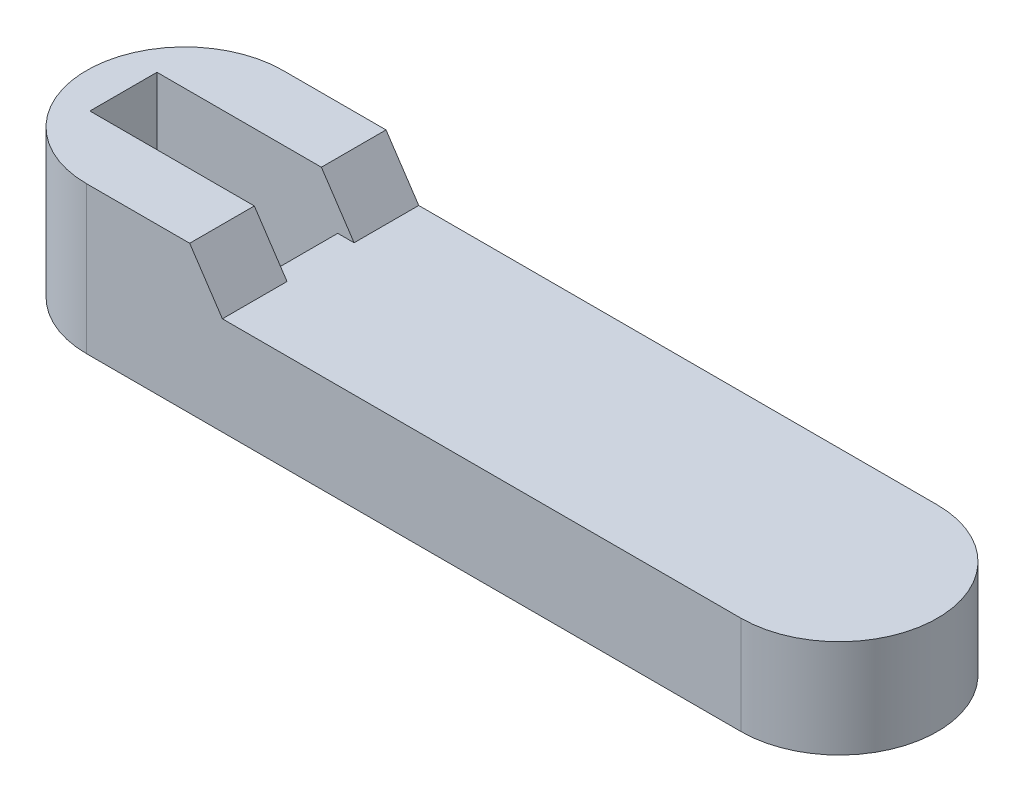
ISO-10303-21;
HEADER;
FILE_DESCRIPTION(('STEP AP214'),'2;1');
FILE_NAME('part.step','',(''),(''),'','','');
FILE_SCHEMA(('AUTOMOTIVE_DESIGN { 1 0 10303 214 1 1 1 1 }'));
ENDSEC;
DATA;
#1=APPLICATION_CONTEXT('core data for automotive mechanical design processes');
#2=APPLICATION_PROTOCOL_DEFINITION('international standard','automotive_design',2000,#1);
#3=PRODUCT_CONTEXT('',#1,'mechanical');
#4=PRODUCT('Part','Part','',(#3));
#5=PRODUCT_RELATED_PRODUCT_CATEGORY('part','',(#4));
#6=PRODUCT_DEFINITION_FORMATION('','',#4);
#7=PRODUCT_DEFINITION_CONTEXT('part definition',#1,'design');
#8=PRODUCT_DEFINITION('design','',#6,#7);
#9=PRODUCT_DEFINITION_SHAPE('','',#8);
#10=(LENGTH_UNIT() NAMED_UNIT(*) SI_UNIT(.MILLI.,.METRE.));
#11=(NAMED_UNIT(*) PLANE_ANGLE_UNIT() SI_UNIT($,.RADIAN.));
#12=(NAMED_UNIT(*) SI_UNIT($,.STERADIAN.) SOLID_ANGLE_UNIT());
#13=UNCERTAINTY_MEASURE_WITH_UNIT(LENGTH_MEASURE(1.E-05),#10,'distance_accuracy_value','');
#14=(GEOMETRIC_REPRESENTATION_CONTEXT(3) GLOBAL_UNCERTAINTY_ASSIGNED_CONTEXT((#13)) GLOBAL_UNIT_ASSIGNED_CONTEXT((#10,
#11,#12)) REPRESENTATION_CONTEXT('',''));
#15=CARTESIAN_POINT('',(0.,0.,0.));
#16=DIRECTION('',(0.,0.,1.));
#17=DIRECTION('',(1.,0.,0.));
#18=AXIS2_PLACEMENT_3D('',#15,#16,#17);
#19=CARTESIAN_POINT('',(0.,0.,-30.));
#20=DIRECTION('',(0.,-1.,0.));
#21=DIRECTION('',(0.,0.,-1.));
#22=AXIS2_PLACEMENT_3D('',#19,#20,#21);
#23=PLANE('',#22);
#24=DIRECTION('',(-0.798493054764566,0.,0.602004021159952));
#25=VECTOR('',#24,1.);
#26=CARTESIAN_POINT('',(75.9918904929551,0.,70.7950024322706));
#27=LINE('',#26,#25);
#28=CARTESIAN_POINT('',(197.587164312227,0.,-20.8787364392969));
#29=VERTEX_POINT('',#28);
#30=CARTESIAN_POINT('',(184.57486063476,0.,-11.0684330288318));
#31=VERTEX_POINT('',#30);
#32=EDGE_CURVE('E11',#29,#31,#27,.T.);
#33=ORIENTED_EDGE('',*,*,#32,.F.);
#34=CARTESIAN_POINT('',(200.,0.,-29.9999999999999));
#35=DIRECTION('',(0.,-1.,0.));
#36=DIRECTION('',(0.,0.,-1.));
#37=AXIS2_PLACEMENT_3D('',#34,#35,#36);
#38=CIRCLE('',#37,9.435);
#39=CARTESIAN_POINT('',(202.184413083806,0.,-20.8213527968823));
#40=VERTEX_POINT('',#39);
#41=EDGE_CURVE('E55',#29,#40,#38,.F.);
#42=ORIENTED_EDGE('',*,*,#41,.T.);
#43=DIRECTION('',(-0.783217983430102,0.,-0.621747207819773));
#44=VECTOR('',#43,1.);
#45=CARTESIAN_POINT('',(73.6886787245262,0.,-122.82598719604));
#46=LINE('',#45,#44);
#47=CARTESIAN_POINT('',(214.947793034619,0.,-10.6893129118849));
#48=VERTEX_POINT('',#47);
#49=EDGE_CURVE('E498',#48,#40,#46,.T.);
#50=ORIENTED_EDGE('',*,*,#49,.F.);
#51=CARTESIAN_POINT('',(216.691793952553,0.,-12.8862393554063));
#52=DIRECTION('',(0.,-1.,0.));
#53=DIRECTION('',(0.,0.,-1.));
#54=AXIS2_PLACEMENT_3D('',#51,#52,#53);
#55=CIRCLE('',#54,2.805);
#56=CARTESIAN_POINT('',(218.931566971168,0.,-14.57486063476));
#57=VERTEX_POINT('',#56);
#58=EDGE_CURVE('E495',#57,#48,#55,.T.);
#59=ORIENTED_EDGE('',*,*,#58,.F.);
#60=DIRECTION('',(0.60200402115995,0.,0.798493054764568));
#61=VECTOR('',#60,1.);
#62=CARTESIAN_POINT('',(132.174028166408,0.,-129.649328161717));
#63=LINE('',#62,#61);
#64=CARTESIAN_POINT('',(209.121263560703,0.,-27.5871643122269));
#65=VERTEX_POINT('',#64);
#66=EDGE_CURVE('E492',#65,#57,#63,.T.);
#67=ORIENTED_EDGE('',*,*,#66,.F.);
#68=CARTESIAN_POINT('',(200.,0.,-29.9999999999999));
#69=DIRECTION('',(0.,-1.,0.));
#70=DIRECTION('',(0.,0.,-1.));
#71=AXIS2_PLACEMENT_3D('',#68,#69,#70);
#72=CIRCLE('',#71,9.435);
#73=CARTESIAN_POINT('',(209.178647203117,0.,-32.1844130838056));
#74=VERTEX_POINT('',#73);
#75=EDGE_CURVE('E485',#65,#74,#72,.F.);
#76=ORIENTED_EDGE('',*,*,#75,.T.);
#77=DIRECTION('',(-0.621747207819771,0.,0.783217983430104));
#78=VECTOR('',#77,1.);
#79=CARTESIAN_POINT('',(127.252813580003,0.,71.0179582241903));
#80=LINE('',#79,#78);
#81=CARTESIAN_POINT('',(219.310687088115,0.,-44.9477930346189));
#82=VERTEX_POINT('',#81);
#83=EDGE_CURVE('E482',#82,#74,#80,.T.);
#84=ORIENTED_EDGE('',*,*,#83,.F.);
#85=CARTESIAN_POINT('',(217.113760644593,0.,-46.6917939525534));
#86=DIRECTION('',(0.,-1.,0.));
#87=DIRECTION('',(0.,0.,-1.));
#88=AXIS2_PLACEMENT_3D('',#85,#86,#87);
#89=CIRCLE('',#88,2.805);
#90=CARTESIAN_POINT('',(215.42513936524,0.,-48.931566971168));
#91=VERTEX_POINT('',#90);
#92=EDGE_CURVE('E479',#91,#82,#89,.T.);
#93=ORIENTED_EDGE('',*,*,#92,.F.);
#94=DIRECTION('',(0.798493054764566,0.,-0.602004021159952));
#95=VECTOR('',#94,1.);
#96=CARTESIAN_POINT('',(68.9716461041458,0.,61.4834095023544));
#97=LINE('',#96,#95);
#98=CARTESIAN_POINT('',(202.412835687773,0.,-39.1212635607029));
#99=VERTEX_POINT('',#98);
#100=EDGE_CURVE('E476',#99,#91,#97,.T.);
#101=ORIENTED_EDGE('',*,*,#100,.F.);
#102=CARTESIAN_POINT('',(200.,0.,-29.9999999999999));
#103=DIRECTION('',(0.,-1.,0.));
#104=DIRECTION('',(0.,0.,-1.));
#105=AXIS2_PLACEMENT_3D('',#102,#103,#104);
#106=CIRCLE('',#105,9.435);
#107=CARTESIAN_POINT('',(197.815586916194,0.,-39.1786472031175));
#108=VERTEX_POINT('',#107);
#109=EDGE_CURVE('E469',#99,#108,#106,.F.);
#110=ORIENTED_EDGE('',*,*,#109,.T.);
#111=DIRECTION('',(0.783217983430098,0.,0.621747207819779));
#112=VECTOR('',#111,1.);
#113=CARTESIAN_POINT('',(80.9391574481488,0.,-131.95945052872));
#114=LINE('',#113,#112);
#115=CARTESIAN_POINT('',(185.052206965381,0.,-49.310687088115));
#116=VERTEX_POINT('',#115);
#117=EDGE_CURVE('E464',#116,#108,#114,.T.);
#118=ORIENTED_EDGE('',*,*,#117,.F.);
#119=CARTESIAN_POINT('',(183.308206047447,0.,-47.1137606445936));
#120=DIRECTION('',(0.,-1.,0.));
#121=DIRECTION('',(0.,0.,-1.));
#122=AXIS2_PLACEMENT_3D('',#119,#120,#121);
#123=CIRCLE('',#122,2.805);
#124=CARTESIAN_POINT('',(181.068433028832,0.,-45.4251393652399));
#125=VERTEX_POINT('',#124);
#126=EDGE_CURVE('E461',#125,#116,#123,.T.);
#127=ORIENTED_EDGE('',*,*,#126,.F.);
#128=DIRECTION('',(-0.602004021159944,0.,-0.798493054764572));
#129=VECTOR('',#128,1.);
#130=CARTESIAN_POINT('',(122.862435236493,0.,-122.629083772907));
#131=LINE('',#130,#129);
#132=CARTESIAN_POINT('',(190.878736439297,0.,-32.412835687773));
#133=VERTEX_POINT('',#132);
#134=EDGE_CURVE('E458',#133,#125,#131,.T.);
#135=ORIENTED_EDGE('',*,*,#134,.F.);
#136=CARTESIAN_POINT('',(200.,0.,-29.9999999999999));
#137=DIRECTION('',(0.,-1.,0.));
#138=DIRECTION('',(0.,0.,-1.));
#139=AXIS2_PLACEMENT_3D('',#136,#137,#138);
#140=CIRCLE('',#139,9.435);
#141=CARTESIAN_POINT('',(190.821352796882,0.,-27.8155869161941));
#142=VERTEX_POINT('',#141);
#143=EDGE_CURVE('E256',#133,#142,#140,.F.);
#144=ORIENTED_EDGE('',*,*,#143,.T.);
#145=DIRECTION('',(0.621747207819771,0.,-0.783217983430104));
#146=VECTOR('',#145,1.);
#147=CARTESIAN_POINT('',(118.119350247324,0.,63.7674795005691));
#148=LINE('',#147,#146);
#149=CARTESIAN_POINT('',(180.689312911885,0.,-15.0522069653808));
#150=VERTEX_POINT('',#149);
#151=EDGE_CURVE('E473',#150,#142,#148,.T.);
#152=ORIENTED_EDGE('',*,*,#151,.F.);
#153=CARTESIAN_POINT('',(182.886239355406,0.,-13.3082060474464));
#154=DIRECTION('',(0.,-1.,0.));
#155=DIRECTION('',(0.,0.,-1.));
#156=AXIS2_PLACEMENT_3D('',#153,#154,#155);
#157=CIRCLE('',#156,2.805);
#158=EDGE_CURVE('E489',#31,#150,#157,.T.);
#159=ORIENTED_EDGE('',*,*,#158,.F.);
#160=EDGE_LOOP('',(#33,#42,#50,#59,#67,#76,#84,#93,#101,#110,#118,#127,#135,#144,#152,#159));
#161=FACE_BOUND('',#160,.T.);
#162=CARTESIAN_POINT('',(0.,0.,-30.));
#163=DIRECTION('',(0.,1.,0.));
#164=DIRECTION('',(0.,0.,1.));
#165=AXIS2_PLACEMENT_3D('',#162,#163,#164);
#166=CIRCLE('',#165,7.);
#167=CARTESIAN_POINT('',(0.,0.,-23.));
#168=VERTEX_POINT('',#167);
#169=EDGE_CURVE('E411',#168,#168,#166,.T.);
#170=ORIENTED_EDGE('',*,*,#169,.T.);
#171=EDGE_LOOP('',(#170));
#172=FACE_BOUND('',#171,.T.);
#173=CARTESIAN_POINT('',(0.,0.,-30.));
#174=DIRECTION('',(0.,1.,0.));
#175=DIRECTION('',(0.,0.,-1.));
#176=AXIS2_PLACEMENT_3D('',#173,#174,#175);
#177=CIRCLE('',#176,30.);
#178=CARTESIAN_POINT('',(0.,0.,-60.));
#179=VERTEX_POINT('',#178);
#180=CARTESIAN_POINT('',(0.,0.,0.));
#181=VERTEX_POINT('',#180);
#182=EDGE_CURVE('E415',#179,#181,#177,.T.);
#183=ORIENTED_EDGE('',*,*,#182,.F.);
#184=DIRECTION('',(-1.,0.,0.));
#185=VECTOR('',#184,1.);
#186=CARTESIAN_POINT('',(0.,0.,-60.));
#187=LINE('',#186,#185);
#188=CARTESIAN_POINT('',(200.,0.,-60.));
#189=VERTEX_POINT('',#188);
#190=EDGE_CURVE('E420',#189,#179,#187,.T.);
#191=ORIENTED_EDGE('',*,*,#190,.F.);
#192=CARTESIAN_POINT('',(200.,0.,-30.));
#193=DIRECTION('',(0.,1.,0.));
#194=DIRECTION('',(0.,0.,1.));
#195=AXIS2_PLACEMENT_3D('',#192,#193,#194);
#196=CIRCLE('',#195,30.);
#197=CARTESIAN_POINT('',(200.,0.,0.));
#198=VERTEX_POINT('',#197);
#199=EDGE_CURVE('E434',#198,#189,#196,.T.);
#200=ORIENTED_EDGE('',*,*,#199,.F.);
#201=DIRECTION('',(1.,0.,0.));
#202=VECTOR('',#201,1.);
#203=CARTESIAN_POINT('',(0.,0.,0.));
#204=LINE('',#203,#202);
#205=EDGE_CURVE('E431',#181,#198,#204,.T.);
#206=ORIENTED_EDGE('',*,*,#205,.F.);
#207=EDGE_LOOP('',(#183,#191,#200,#206));
#208=FACE_BOUND('',#207,.T.);
#209=ADVANCED_FACE('F46',(#161,#172,#208),#23,.T.);
#210=CARTESIAN_POINT('',(0.,30.,-30.));
#211=DIRECTION('',(0.,-1.,0.));
#212=DIRECTION('',(0.,0.,-1.));
#213=AXIS2_PLACEMENT_3D('',#210,#211,#212);
#214=PLANE('',#213);
#215=DIRECTION('',(0.,0.,-1.));
#216=VECTOR('',#215,1.);
#217=CARTESIAN_POINT('',(41.5,30.,-40.25));
#218=LINE('',#217,#216);
#219=CARTESIAN_POINT('',(41.5,30.,-40.25));
#220=VERTEX_POINT('',#219);
#221=CARTESIAN_POINT('',(41.5,30.,-60.));
#222=VERTEX_POINT('',#221);
#223=EDGE_CURVE('E339',#220,#222,#218,.T.);
#224=ORIENTED_EDGE('',*,*,#223,.F.);
#225=DIRECTION('',(1.,0.,0.));
#226=VECTOR('',#225,1.);
#227=CARTESIAN_POINT('',(-18.75,30.,-40.25));
#228=LINE('',#227,#226);
#229=CARTESIAN_POINT('',(36.5,30.,-40.25));
#230=VERTEX_POINT('',#229);
#231=EDGE_CURVE('E364',#230,#220,#228,.T.);
#232=ORIENTED_EDGE('',*,*,#231,.F.);
#233=DIRECTION('',(0.,0.,-1.));
#234=VECTOR('',#233,1.);
#235=CARTESIAN_POINT('',(36.5,30.,-40.25));
#236=LINE('',#235,#234);
#237=CARTESIAN_POINT('',(36.5,30.,-19.75));
#238=VERTEX_POINT('',#237);
#239=EDGE_CURVE('E363',#238,#230,#236,.T.);
#240=ORIENTED_EDGE('',*,*,#239,.F.);
#241=DIRECTION('',(-1.,0.,0.));
#242=VECTOR('',#241,1.);
#243=CARTESIAN_POINT('',(-18.75,30.,-19.75));
#244=LINE('',#243,#242);
#245=CARTESIAN_POINT('',(41.5,30.,-19.75));
#246=VERTEX_POINT('',#245);
#247=EDGE_CURVE('E345',#246,#238,#244,.T.);
#248=ORIENTED_EDGE('',*,*,#247,.F.);
#249=DIRECTION('',(0.,0.,-1.));
#250=VECTOR('',#249,1.);
#251=CARTESIAN_POINT('',(41.5,30.,-19.75));
#252=LINE('',#251,#250);
#253=CARTESIAN_POINT('',(41.5,30.,0.));
#254=VERTEX_POINT('',#253);
#255=EDGE_CURVE('E372',#254,#246,#252,.T.);
#256=ORIENTED_EDGE('',*,*,#255,.F.);
#257=DIRECTION('',(1.,0.,0.));
#258=VECTOR('',#257,1.);
#259=CARTESIAN_POINT('',(0.,30.,0.));
#260=LINE('',#259,#258);
#261=CARTESIAN_POINT('',(200.,30.,0.));
#262=VERTEX_POINT('',#261);
#263=EDGE_CURVE('E416',#254,#262,#260,.T.);
#264=ORIENTED_EDGE('',*,*,#263,.T.);
#265=CARTESIAN_POINT('',(200.,30.,-30.));
#266=DIRECTION('',(0.,1.,0.));
#267=DIRECTION('',(0.,0.,1.));
#268=AXIS2_PLACEMENT_3D('',#265,#266,#267);
#269=CIRCLE('',#268,30.);
#270=CARTESIAN_POINT('',(200.,30.,-60.));
#271=VERTEX_POINT('',#270);
#272=EDGE_CURVE('E419',#262,#271,#269,.T.);
#273=ORIENTED_EDGE('',*,*,#272,.T.);
#274=DIRECTION('',(-1.,0.,0.));
#275=VECTOR('',#274,1.);
#276=CARTESIAN_POINT('',(0.,30.,-60.));
#277=LINE('',#276,#275);
#278=EDGE_CURVE('E423',#271,#222,#277,.T.);
#279=ORIENTED_EDGE('',*,*,#278,.T.);
#280=EDGE_LOOP('',(#224,#232,#240,#248,#256,#264,#273,#279));
#281=FACE_BOUND('',#280,.T.);
#282=ADVANCED_FACE('F597',(#281),#214,.F.);
#283=CARTESIAN_POINT('',(0.,30.,-30.));
#284=DIRECTION('',(0.,-1.,0.));
#285=DIRECTION('',(0.,0.,-1.));
#286=AXIS2_PLACEMENT_3D('',#283,#284,#285);
#287=CYLINDRICAL_SURFACE('',#286,30.);
#288=ORIENTED_EDGE('',*,*,#182,.T.);
#289=DIRECTION('',(0.,-1.,0.));
#290=VECTOR('',#289,1.);
#291=CARTESIAN_POINT('',(0.,30.,0.));
#292=LINE('',#291,#290);
#293=CARTESIAN_POINT('',(1.04744440165294E-13,45.,0.));
#294=VERTEX_POINT('',#293);
#295=EDGE_CURVE('E369',#294,#181,#292,.T.);
#296=ORIENTED_EDGE('',*,*,#295,.F.);
#297=CARTESIAN_POINT('',(1.04744440165294E-13,45.,-30.));
#298=DIRECTION('',(0.,1.,0.));
#299=DIRECTION('',(0.,0.,1.));
#300=AXIS2_PLACEMENT_3D('',#297,#298,#299);
#301=CIRCLE('',#300,30.);
#302=CARTESIAN_POINT('',(-1.04744440165294E-13,45.,-60.));
#303=VERTEX_POINT('',#302);
#304=EDGE_CURVE('E352',#303,#294,#301,.T.);
#305=ORIENTED_EDGE('',*,*,#304,.F.);
#306=DIRECTION('',(0.,-1.,0.));
#307=VECTOR('',#306,1.);
#308=CARTESIAN_POINT('',(0.,30.,-60.));
#309=LINE('',#308,#307);
#310=EDGE_CURVE('E427',#303,#179,#309,.T.);
#311=ORIENTED_EDGE('',*,*,#310,.T.);
#312=EDGE_LOOP('',(#288,#296,#305,#311));
#313=FACE_BOUND('',#312,.T.);
#314=ADVANCED_FACE('F48',(#313),#287,.T.);
#315=CARTESIAN_POINT('',(0.,30.,0.));
#316=DIRECTION('',(0.,0.,-1.));
#317=DIRECTION('',(-1.,0.,0.));
#318=AXIS2_PLACEMENT_3D('',#315,#316,#317);
#319=PLANE('',#318);
#320=ORIENTED_EDGE('',*,*,#263,.F.);
#321=DIRECTION('',(0.554700196225229,-0.832050294337843,0.));
#322=VECTOR('',#321,1.);
#323=CARTESIAN_POINT('',(41.5,30.,0.));
#324=LINE('',#323,#322);
#325=CARTESIAN_POINT('',(31.5,45.,0.));
#326=VERTEX_POINT('',#325);
#327=EDGE_CURVE('E323',#326,#254,#324,.T.);
#328=ORIENTED_EDGE('',*,*,#327,.F.);
#329=DIRECTION('',(1.,0.,0.));
#330=VECTOR('',#329,1.);
#331=CARTESIAN_POINT('',(41.5,45.,0.));
#332=LINE('',#331,#330);
#333=EDGE_CURVE('E356',#294,#326,#332,.T.);
#334=ORIENTED_EDGE('',*,*,#333,.F.);
#335=ORIENTED_EDGE('',*,*,#295,.T.);
#336=ORIENTED_EDGE('',*,*,#205,.T.);
#337=DIRECTION('',(0.,-1.,0.));
#338=VECTOR('',#337,1.);
#339=CARTESIAN_POINT('',(200.,30.,0.));
#340=LINE('',#339,#338);
#341=EDGE_CURVE('E446',#262,#198,#340,.T.);
#342=ORIENTED_EDGE('',*,*,#341,.F.);
#343=EDGE_LOOP('',(#320,#328,#334,#335,#336,#342));
#344=FACE_BOUND('',#343,.T.);
#345=ADVANCED_FACE('F613',(#344),#319,.F.);
#346=CARTESIAN_POINT('',(200.,30.,-30.));
#347=DIRECTION('',(0.,-1.,0.));
#348=DIRECTION('',(0.,0.,-1.));
#349=AXIS2_PLACEMENT_3D('',#346,#347,#348);
#350=CYLINDRICAL_SURFACE('',#349,30.);
#351=ORIENTED_EDGE('',*,*,#199,.T.);
#352=DIRECTION('',(0.,-1.,0.));
#353=VECTOR('',#352,1.);
#354=CARTESIAN_POINT('',(200.,30.,-60.));
#355=LINE('',#354,#353);
#356=EDGE_CURVE('E442',#271,#189,#355,.T.);
#357=ORIENTED_EDGE('',*,*,#356,.F.);
#358=ORIENTED_EDGE('',*,*,#272,.F.);
#359=ORIENTED_EDGE('',*,*,#341,.T.);
#360=EDGE_LOOP('',(#351,#357,#358,#359));
#361=FACE_BOUND('',#360,.T.);
#362=ADVANCED_FACE('F610',(#361),#350,.T.);
#363=CARTESIAN_POINT('',(0.,30.,-60.));
#364=DIRECTION('',(0.,0.,1.));
#365=DIRECTION('',(1.,0.,0.));
#366=AXIS2_PLACEMENT_3D('',#363,#364,#365);
#367=PLANE('',#366);
#368=DIRECTION('',(-1.,0.,0.));
#369=VECTOR('',#368,1.);
#370=CARTESIAN_POINT('',(41.5,45.,-60.));
#371=LINE('',#370,#369);
#372=CARTESIAN_POINT('',(31.5,45.,-60.));
#373=VERTEX_POINT('',#372);
#374=EDGE_CURVE('E349',#373,#303,#371,.T.);
#375=ORIENTED_EDGE('',*,*,#374,.F.);
#376=DIRECTION('',(0.554700196225229,-0.832050294337843,0.));
#377=VECTOR('',#376,1.);
#378=CARTESIAN_POINT('',(41.5,30.,-60.));
#379=LINE('',#378,#377);
#380=EDGE_CURVE('E324',#373,#222,#379,.T.);
#381=ORIENTED_EDGE('',*,*,#380,.T.);
#382=ORIENTED_EDGE('',*,*,#278,.F.);
#383=ORIENTED_EDGE('',*,*,#356,.T.);
#384=ORIENTED_EDGE('',*,*,#190,.T.);
#385=ORIENTED_EDGE('',*,*,#310,.F.);
#386=EDGE_LOOP('',(#375,#381,#382,#383,#384,#385));
#387=FACE_BOUND('',#386,.T.);
#388=ADVANCED_FACE('F606',(#387),#367,.F.);
#389=CARTESIAN_POINT('',(0.,0.,-30.));
#390=DIRECTION('',(0.,1.,0.));
#391=DIRECTION('',(0.,0.,1.));
#392=AXIS2_PLACEMENT_3D('',#389,#390,#391);
#393=CYLINDRICAL_SURFACE('',#392,7.);
#394=CARTESIAN_POINT('',(0.,1.5,-30.));
#395=DIRECTION('',(0.,-1.,0.));
#396=DIRECTION('',(0.,0.,-1.));
#397=AXIS2_PLACEMENT_3D('',#394,#395,#396);
#398=CIRCLE('',#397,7.);
#399=CARTESIAN_POINT('',(0.,1.5,-37.));
#400=VERTEX_POINT('',#399);
#401=EDGE_CURVE('E401',#400,#400,#398,.F.);
#402=ORIENTED_EDGE('',*,*,#401,.T.);
#403=EDGE_LOOP('',(#402));
#404=FACE_BOUND('',#403,.T.);
#405=ORIENTED_EDGE('',*,*,#169,.F.);
#406=EDGE_LOOP('',(#405));
#407=FACE_BOUND('',#406,.T.);
#408=ADVANCED_FACE('F609',(#404,#407),#393,.F.);
#409=CARTESIAN_POINT('',(0.,1.5,0.));
#410=DIRECTION('',(0.,-1.,0.));
#411=DIRECTION('',(0.,0.,-1.));
#412=AXIS2_PLACEMENT_3D('',#409,#410,#411);
#413=PLANE('',#412);
#414=DIRECTION('',(-1.,0.,0.));
#415=VECTOR('',#414,1.);
#416=CARTESIAN_POINT('',(-18.75,1.5,-40.25));
#417=LINE('',#416,#415);
#418=CARTESIAN_POINT('',(36.5,1.5,-40.25));
#419=VERTEX_POINT('',#418);
#420=CARTESIAN_POINT('',(-18.75,1.5,-40.25));
#421=VERTEX_POINT('',#420);
#422=EDGE_CURVE('E378',#419,#421,#417,.T.);
#423=ORIENTED_EDGE('',*,*,#422,.T.);
#424=DIRECTION('',(0.,0.,1.));
#425=VECTOR('',#424,1.);
#426=CARTESIAN_POINT('',(-18.75,1.5,-40.25));
#427=LINE('',#426,#425);
#428=CARTESIAN_POINT('',(-18.75,1.5,-19.75));
#429=VERTEX_POINT('',#428);
#430=EDGE_CURVE('E382',#421,#429,#427,.T.);
#431=ORIENTED_EDGE('',*,*,#430,.T.);
#432=DIRECTION('',(1.,0.,0.));
#433=VECTOR('',#432,1.);
#434=CARTESIAN_POINT('',(-18.75,1.5,-19.75));
#435=LINE('',#434,#433);
#436=CARTESIAN_POINT('',(36.5,1.5,-19.75));
#437=VERTEX_POINT('',#436);
#438=EDGE_CURVE('E386',#429,#437,#435,.T.);
#439=ORIENTED_EDGE('',*,*,#438,.T.);
#440=DIRECTION('',(0.,0.,-1.));
#441=VECTOR('',#440,1.);
#442=CARTESIAN_POINT('',(36.5,1.5,-40.25));
#443=LINE('',#442,#441);
#444=EDGE_CURVE('E389',#437,#419,#443,.T.);
#445=ORIENTED_EDGE('',*,*,#444,.T.);
#446=EDGE_LOOP('',(#423,#431,#439,#445));
#447=FACE_BOUND('',#446,.T.);
#448=ORIENTED_EDGE('',*,*,#401,.F.);
#449=EDGE_LOOP('',(#448));
#450=FACE_BOUND('',#449,.T.);
#451=ADVANCED_FACE('F659',(#447,#450),#413,.F.);
#452=CARTESIAN_POINT('',(0.,1.5,-40.25));
#453=DIRECTION('',(0.,0.,-1.));
#454=DIRECTION('',(-1.,0.,0.));
#455=AXIS2_PLACEMENT_3D('',#452,#453,#454);
#456=PLANE('',#455);
#457=ORIENTED_EDGE('',*,*,#231,.T.);
#458=DIRECTION('',(-0.554700196225229,0.832050294337844,0.));
#459=VECTOR('',#458,1.);
#460=CARTESIAN_POINT('',(41.8846153846154,29.4230769230769,-40.25));
#461=LINE('',#460,#459);
#462=CARTESIAN_POINT('',(31.5,45.,-40.25));
#463=VERTEX_POINT('',#462);
#464=EDGE_CURVE('E335',#220,#463,#461,.T.);
#465=ORIENTED_EDGE('',*,*,#464,.T.);
#466=DIRECTION('',(1.,0.,0.));
#467=VECTOR('',#466,1.);
#468=CARTESIAN_POINT('',(-18.75,45.,-40.25));
#469=LINE('',#468,#467);
#470=CARTESIAN_POINT('',(-18.75,45.,-40.25));
#471=VERTEX_POINT('',#470);
#472=EDGE_CURVE('E344',#471,#463,#469,.T.);
#473=ORIENTED_EDGE('',*,*,#472,.F.);
#474=DIRECTION('',(0.,1.,0.));
#475=VECTOR('',#474,1.);
#476=CARTESIAN_POINT('',(-18.75,1.5,-40.25));
#477=LINE('',#476,#475);
#478=EDGE_CURVE('E393',#421,#471,#477,.T.);
#479=ORIENTED_EDGE('',*,*,#478,.F.);
#480=ORIENTED_EDGE('',*,*,#422,.F.);
#481=DIRECTION('',(0.,1.,0.));
#482=VECTOR('',#481,1.);
#483=CARTESIAN_POINT('',(36.5,1.5,-40.25));
#484=LINE('',#483,#482);
#485=EDGE_CURVE('E397',#419,#230,#484,.T.);
#486=ORIENTED_EDGE('',*,*,#485,.T.);
#487=EDGE_LOOP('',(#457,#465,#473,#479,#480,#486));
#488=FACE_BOUND('',#487,.T.);
#489=ADVANCED_FACE('F651',(#488),#456,.F.);
#490=CARTESIAN_POINT('',(36.5,1.5,-40.25));
#491=DIRECTION('',(1.,0.,0.));
#492=DIRECTION('',(0.,0.,-1.));
#493=AXIS2_PLACEMENT_3D('',#490,#491,#492);
#494=PLANE('',#493);
#495=ORIENTED_EDGE('',*,*,#239,.T.);
#496=ORIENTED_EDGE('',*,*,#485,.F.);
#497=ORIENTED_EDGE('',*,*,#444,.F.);
#498=DIRECTION('',(0.,1.,0.));
#499=VECTOR('',#498,1.);
#500=CARTESIAN_POINT('',(36.5,1.5,-19.75));
#501=LINE('',#500,#499);
#502=EDGE_CURVE('E402',#437,#238,#501,.T.);
#503=ORIENTED_EDGE('',*,*,#502,.T.);
#504=EDGE_LOOP('',(#495,#496,#497,#503));
#505=FACE_BOUND('',#504,.T.);
#506=ADVANCED_FACE('F656',(#505),#494,.F.);
#507=CARTESIAN_POINT('',(36.5,1.5,-19.75));
#508=DIRECTION('',(0.,0.,1.));
#509=DIRECTION('',(1.,0.,0.));
#510=AXIS2_PLACEMENT_3D('',#507,#508,#509);
#511=PLANE('',#510);
#512=DIRECTION('',(-1.,0.,0.));
#513=VECTOR('',#512,1.);
#514=CARTESIAN_POINT('',(-18.75,45.,-19.75));
#515=LINE('',#514,#513);
#516=CARTESIAN_POINT('',(31.5,45.,-19.75));
#517=VERTEX_POINT('',#516);
#518=CARTESIAN_POINT('',(-18.75,45.,-19.75));
#519=VERTEX_POINT('',#518);
#520=EDGE_CURVE('E360',#517,#519,#515,.T.);
#521=ORIENTED_EDGE('',*,*,#520,.F.);
#522=DIRECTION('',(0.554700196225229,-0.832050294337844,0.));
#523=VECTOR('',#522,1.);
#524=CARTESIAN_POINT('',(53.1153846153846,12.5769230769231,-19.75));
#525=LINE('',#524,#523);
#526=EDGE_CURVE('E70',#517,#246,#525,.T.);
#527=ORIENTED_EDGE('',*,*,#526,.T.);
#528=ORIENTED_EDGE('',*,*,#247,.T.);
#529=ORIENTED_EDGE('',*,*,#502,.F.);
#530=ORIENTED_EDGE('',*,*,#438,.F.);
#531=DIRECTION('',(0.,1.,0.));
#532=VECTOR('',#531,1.);
#533=CARTESIAN_POINT('',(-18.75,1.5,-19.75));
#534=LINE('',#533,#532);
#535=EDGE_CURVE('E405',#429,#519,#534,.T.);
#536=ORIENTED_EDGE('',*,*,#535,.T.);
#537=EDGE_LOOP('',(#521,#527,#528,#529,#530,#536));
#538=FACE_BOUND('',#537,.T.);
#539=ADVANCED_FACE('F634',(#538),#511,.F.);
#540=CARTESIAN_POINT('',(-18.75,1.5,-40.25));
#541=DIRECTION('',(-1.,0.,0.));
#542=DIRECTION('',(0.,0.,1.));
#543=AXIS2_PLACEMENT_3D('',#540,#541,#542);
#544=PLANE('',#543);
#545=ORIENTED_EDGE('',*,*,#478,.T.);
#546=DIRECTION('',(0.,0.,-1.));
#547=VECTOR('',#546,1.);
#548=CARTESIAN_POINT('',(-18.75,45.,-40.25));
#549=LINE('',#548,#547);
#550=EDGE_CURVE('E340',#519,#471,#549,.T.);
#551=ORIENTED_EDGE('',*,*,#550,.F.);
#552=ORIENTED_EDGE('',*,*,#535,.F.);
#553=ORIENTED_EDGE('',*,*,#430,.F.);
#554=EDGE_LOOP('',(#545,#551,#552,#553));
#555=FACE_BOUND('',#554,.T.);
#556=ADVANCED_FACE('F662',(#555),#544,.F.);
#557=CARTESIAN_POINT('',(1.04744440165294E-13,45.,-30.));
#558=DIRECTION('',(0.,1.,0.));
#559=DIRECTION('',(0.,0.,1.));
#560=AXIS2_PLACEMENT_3D('',#557,#558,#559);
#561=PLANE('',#560);
#562=DIRECTION('',(0.,0.,1.));
#563=VECTOR('',#562,1.);
#564=CARTESIAN_POINT('',(31.5,45.,-60.));
#565=LINE('',#564,#563);
#566=EDGE_CURVE('E328',#373,#463,#565,.T.);
#567=ORIENTED_EDGE('',*,*,#566,.F.);
#568=ORIENTED_EDGE('',*,*,#374,.T.);
#569=ORIENTED_EDGE('',*,*,#304,.T.);
#570=ORIENTED_EDGE('',*,*,#333,.T.);
#571=DIRECTION('',(0.,0.,1.));
#572=VECTOR('',#571,1.);
#573=CARTESIAN_POINT('',(31.5,45.,-30.));
#574=LINE('',#573,#572);
#575=EDGE_CURVE('E368',#517,#326,#574,.T.);
#576=ORIENTED_EDGE('',*,*,#575,.F.);
#577=ORIENTED_EDGE('',*,*,#520,.T.);
#578=ORIENTED_EDGE('',*,*,#550,.T.);
#579=ORIENTED_EDGE('',*,*,#472,.T.);
#580=EDGE_LOOP('',(#567,#568,#569,#570,#576,#577,#578,#579));
#581=FACE_BOUND('',#580,.T.);
#582=ADVANCED_FACE('F640',(#581),#561,.T.);
#583=CARTESIAN_POINT('',(41.5,30.,-60.));
#584=DIRECTION('',(-0.832050294337843,-0.554700196225229,0.));
#585=DIRECTION('',(0.554700196225229,-0.832050294337844,0.));
#586=AXIS2_PLACEMENT_3D('',#583,#584,#585);
#587=PLANE('',#586);
#588=ORIENTED_EDGE('',*,*,#575,.T.);
#589=ORIENTED_EDGE('',*,*,#327,.T.);
#590=ORIENTED_EDGE('',*,*,#255,.T.);
#591=ORIENTED_EDGE('',*,*,#526,.F.);
#592=EDGE_LOOP('',(#588,#589,#590,#591));
#593=FACE_BOUND('',#592,.T.);
#594=ADVANCED_FACE('F631',(#593),#587,.F.);
#595=ORIENTED_EDGE('',*,*,#223,.T.);
#596=ORIENTED_EDGE('',*,*,#380,.F.);
#597=ORIENTED_EDGE('',*,*,#566,.T.);
#598=ORIENTED_EDGE('',*,*,#464,.F.);
#599=EDGE_LOOP('',(#595,#596,#597,#598));
#600=FACE_BOUND('',#599,.T.);
#601=ADVANCED_FACE('F663',(#600),#587,.F.);
#602=CARTESIAN_POINT('',(200.,-2.16000000000008,-29.9999999999999));
#603=DIRECTION('',(0.,1.,0.));
#604=DIRECTION('',(0.715877242197863,0.,-0.698226162574264));
#605=AXIS2_PLACEMENT_3D('',#602,#603,#604);
#606=CYLINDRICAL_SURFACE('',#605,9.435);
#607=DIRECTION('',(0.,-1.,0.));
#608=VECTOR('',#607,1.);
#609=CARTESIAN_POINT('',(202.412835687773,26.986050724231,-39.1212635607029));
#610=LINE('',#609,#608);
#611=CARTESIAN_POINT('',(202.412835687773,4.97999999999992,-39.1212635607029));
#612=VERTEX_POINT('',#611);
#613=EDGE_CURVE('E292',#612,#99,#610,.T.);
#614=ORIENTED_EDGE('',*,*,#613,.F.);
#615=CARTESIAN_POINT('',(200.,4.97999999999992,-29.9999999999999));
#616=DIRECTION('',(0.,1.,0.));
#617=DIRECTION('',(0.715877242197863,0.,-0.698226162574264));
#618=AXIS2_PLACEMENT_3D('',#615,#616,#617);
#619=CIRCLE('',#618,9.435);
#620=CARTESIAN_POINT('',(197.815586916194,4.97999999999992,-39.1786472031175));
#621=VERTEX_POINT('',#620);
#622=EDGE_CURVE('E251',#612,#621,#619,.T.);
#623=ORIENTED_EDGE('',*,*,#622,.T.);
#624=DIRECTION('',(0.,-1.,0.));
#625=VECTOR('',#624,1.);
#626=CARTESIAN_POINT('',(197.815586916194,26.9860507242311,-39.1786472031175));
#627=LINE('',#626,#625);
#628=EDGE_CURVE('E287',#621,#108,#627,.T.);
#629=ORIENTED_EDGE('',*,*,#628,.T.);
#630=ORIENTED_EDGE('',*,*,#109,.F.);
#631=EDGE_LOOP('',(#614,#623,#629,#630));
#632=FACE_BOUND('',#631,.T.);
#633=ADVANCED_FACE('F543',(#632),#606,.F.);
#634=DIRECTION('',(0.,-1.,0.));
#635=VECTOR('',#634,1.);
#636=CARTESIAN_POINT('',(190.878736439297,26.9860507242311,-32.412835687773));
#637=LINE('',#636,#635);
#638=CARTESIAN_POINT('',(190.878736439297,4.97999999999993,-32.412835687773));
#639=VERTEX_POINT('',#638);
#640=EDGE_CURVE('E62',#639,#133,#637,.T.);
#641=ORIENTED_EDGE('',*,*,#640,.F.);
#642=CARTESIAN_POINT('',(200.,4.97999999999992,-29.9999999999999));
#643=DIRECTION('',(0.,1.,0.));
#644=DIRECTION('',(0.715877242197863,0.,-0.698226162574264));
#645=AXIS2_PLACEMENT_3D('',#642,#643,#644);
#646=CIRCLE('',#645,9.435);
#647=CARTESIAN_POINT('',(190.821352796882,4.97999999999993,-27.8155869161941));
#648=VERTEX_POINT('',#647);
#649=EDGE_CURVE('E242',#639,#648,#646,.T.);
#650=ORIENTED_EDGE('',*,*,#649,.T.);
#651=DIRECTION('',(0.,-1.,0.));
#652=VECTOR('',#651,1.);
#653=CARTESIAN_POINT('',(190.821352796882,26.986050724231,-27.8155869161941));
#654=LINE('',#653,#652);
#655=EDGE_CURVE('E271',#648,#142,#654,.T.);
#656=ORIENTED_EDGE('',*,*,#655,.T.);
#657=ORIENTED_EDGE('',*,*,#143,.F.);
#658=EDGE_LOOP('',(#641,#650,#656,#657));
#659=FACE_BOUND('',#658,.T.);
#660=ADVANCED_FACE('F254',(#659),#606,.F.);
#661=DIRECTION('',(0.,-1.,0.));
#662=VECTOR('',#661,1.);
#663=CARTESIAN_POINT('',(197.587164312227,26.986050724231,-20.8787364392969));
#664=LINE('',#663,#662);
#665=CARTESIAN_POINT('',(197.587164312227,4.97999999999992,-20.8787364392969));
#666=VERTEX_POINT('',#665);
#667=EDGE_CURVE('E283',#666,#29,#664,.T.);
#668=ORIENTED_EDGE('',*,*,#667,.F.);
#669=CARTESIAN_POINT('',(200.,4.97999999999992,-29.9999999999999));
#670=DIRECTION('',(0.,1.,0.));
#671=DIRECTION('',(0.715877242197863,0.,-0.698226162574264));
#672=AXIS2_PLACEMENT_3D('',#669,#670,#671);
#673=CIRCLE('',#672,9.435);
#674=CARTESIAN_POINT('',(202.184413083806,4.97999999999992,-20.8213527968823));
#675=VERTEX_POINT('',#674);
#676=EDGE_CURVE('E267',#666,#675,#673,.T.);
#677=ORIENTED_EDGE('',*,*,#676,.T.);
#678=DIRECTION('',(0.,-1.,0.));
#679=VECTOR('',#678,1.);
#680=CARTESIAN_POINT('',(202.184413083806,26.986050724231,-20.8213527968823));
#681=LINE('',#680,#679);
#682=EDGE_CURVE('E288',#675,#40,#681,.T.);
#683=ORIENTED_EDGE('',*,*,#682,.T.);
#684=ORIENTED_EDGE('',*,*,#41,.F.);
#685=EDGE_LOOP('',(#668,#677,#683,#684));
#686=FACE_BOUND('',#685,.T.);
#687=ADVANCED_FACE('F510',(#686),#606,.F.);
#688=DIRECTION('',(0.,-1.,0.));
#689=VECTOR('',#688,1.);
#690=CARTESIAN_POINT('',(209.121263560703,26.986050724231,-27.5871643122269));
#691=LINE('',#690,#689);
#692=CARTESIAN_POINT('',(209.121263560703,4.97999999999992,-27.5871643122269));
#693=VERTEX_POINT('',#692);
#694=EDGE_CURVE('E274',#693,#65,#691,.T.);
#695=ORIENTED_EDGE('',*,*,#694,.F.);
#696=CARTESIAN_POINT('',(200.,4.97999999999992,-29.9999999999999));
#697=DIRECTION('',(0.,1.,0.));
#698=DIRECTION('',(0.715877242197863,0.,-0.698226162574264));
#699=AXIS2_PLACEMENT_3D('',#696,#697,#698);
#700=CIRCLE('',#699,9.435);
#701=CARTESIAN_POINT('',(209.178647203117,4.97999999999992,-32.1844130838056));
#702=VERTEX_POINT('',#701);
#703=EDGE_CURVE('E567',#693,#702,#700,.T.);
#704=ORIENTED_EDGE('',*,*,#703,.T.);
#705=DIRECTION('',(0.,-1.,0.));
#706=VECTOR('',#705,1.);
#707=CARTESIAN_POINT('',(209.178647203117,26.986050724231,-32.1844130838056));
#708=LINE('',#707,#706);
#709=EDGE_CURVE('E304',#702,#74,#708,.T.);
#710=ORIENTED_EDGE('',*,*,#709,.T.);
#711=ORIENTED_EDGE('',*,*,#75,.F.);
#712=EDGE_LOOP('',(#695,#704,#710,#711));
#713=FACE_BOUND('',#712,.T.);
#714=ADVANCED_FACE('F671',(#713),#606,.F.);
#715=CARTESIAN_POINT('',(209.178647203117,26.986050724231,-32.1844130838056));
#716=DIRECTION('',(0.783217983430104,0.,0.621747207819771));
#717=DIRECTION('',(-0.621747207819771,0.,0.783217983430104));
#718=AXIS2_PLACEMENT_3D('',#715,#716,#717);
#719=PLANE('',#718);
#720=ORIENTED_EDGE('',*,*,#83,.T.);
#721=ORIENTED_EDGE('',*,*,#709,.F.);
#722=DIRECTION('',(-0.621747207819771,0.,0.783217983430104));
#723=VECTOR('',#722,1.);
#724=CARTESIAN_POINT('',(209.178647203117,4.97999999999992,-32.1844130838056));
#725=LINE('',#724,#723);
#726=CARTESIAN_POINT('',(219.310687088115,4.97999999999991,-44.9477930346189));
#727=VERTEX_POINT('',#726);
#728=EDGE_CURVE('E563',#727,#702,#725,.T.);
#729=ORIENTED_EDGE('',*,*,#728,.F.);
#730=DIRECTION('',(0.,-1.,0.));
#731=VECTOR('',#730,1.);
#732=CARTESIAN_POINT('',(219.310687088115,26.986050724231,-44.9477930346189));
#733=LINE('',#732,#731);
#734=EDGE_CURVE('E309',#727,#82,#733,.T.);
#735=ORIENTED_EDGE('',*,*,#734,.T.);
#736=EDGE_LOOP('',(#720,#721,#729,#735));
#737=FACE_BOUND('',#736,.T.);
#738=ADVANCED_FACE('F768',(#737),#719,.F.);
#739=CARTESIAN_POINT('',(217.113760644593,26.986050724231,-46.6917939525534));
#740=DIRECTION('',(0.,-1.,0.));
#741=DIRECTION('',(-0.715877242197863,0.,0.698226162574264));
#742=AXIS2_PLACEMENT_3D('',#739,#740,#741);
#743=CYLINDRICAL_SURFACE('',#742,2.805);
#744=ORIENTED_EDGE('',*,*,#92,.T.);
#745=ORIENTED_EDGE('',*,*,#734,.F.);
#746=CARTESIAN_POINT('',(217.113760644593,4.97999999999992,-46.6917939525534));
#747=DIRECTION('',(0.,1.,0.));
#748=DIRECTION('',(0.715877242197863,0.,-0.698226162574264));
#749=AXIS2_PLACEMENT_3D('',#746,#747,#748);
#750=CIRCLE('',#749,2.805);
#751=CARTESIAN_POINT('',(215.42513936524,4.97999999999992,-48.931566971168));
#752=VERTEX_POINT('',#751);
#753=EDGE_CURVE('E552',#752,#727,#750,.F.);
#754=ORIENTED_EDGE('',*,*,#753,.F.);
#755=DIRECTION('',(0.,-1.,0.));
#756=VECTOR('',#755,1.);
#757=CARTESIAN_POINT('',(215.42513936524,26.986050724231,-48.931566971168));
#758=LINE('',#757,#756);
#759=EDGE_CURVE('E313',#752,#91,#758,.T.);
#760=ORIENTED_EDGE('',*,*,#759,.T.);
#761=EDGE_LOOP('',(#744,#745,#754,#760));
#762=FACE_BOUND('',#761,.T.);
#763=ADVANCED_FACE('F593',(#762),#743,.F.);
#764=CARTESIAN_POINT('',(215.42513936524,26.986050724231,-48.931566971168));
#765=DIRECTION('',(-0.602004021159952,0.,-0.798493054764566));
#766=DIRECTION('',(0.798493054764566,0.,-0.602004021159952));
#767=AXIS2_PLACEMENT_3D('',#764,#765,#766);
#768=PLANE('',#767);
#769=ORIENTED_EDGE('',*,*,#100,.T.);
#770=ORIENTED_EDGE('',*,*,#759,.F.);
#771=DIRECTION('',(0.798493054764566,0.,-0.602004021159952));
#772=VECTOR('',#771,1.);
#773=CARTESIAN_POINT('',(215.42513936524,4.97999999999992,-48.931566971168));
#774=LINE('',#773,#772);
#775=EDGE_CURVE('E548',#612,#752,#774,.T.);
#776=ORIENTED_EDGE('',*,*,#775,.F.);
#777=ORIENTED_EDGE('',*,*,#613,.T.);
#778=EDGE_LOOP('',(#769,#770,#776,#777));
#779=FACE_BOUND('',#778,.T.);
#780=ADVANCED_FACE('F545',(#779),#768,.F.);
#781=CARTESIAN_POINT('',(202.184413083806,26.986050724231,-20.8213527968823));
#782=DIRECTION('',(-0.621747207819773,0.,0.783217983430102));
#783=DIRECTION('',(-0.783217983430102,0.,-0.621747207819774));
#784=AXIS2_PLACEMENT_3D('',#781,#782,#783);
#785=PLANE('',#784);
#786=ORIENTED_EDGE('',*,*,#49,.T.);
#787=ORIENTED_EDGE('',*,*,#682,.F.);
#788=DIRECTION('',(-0.783217983430102,0.,-0.621747207819774));
#789=VECTOR('',#788,1.);
#790=CARTESIAN_POINT('',(202.184413083806,4.97999999999992,-20.8213527968823));
#791=LINE('',#790,#789);
#792=CARTESIAN_POINT('',(214.947793034619,4.97999999999992,-10.6893129118849));
#793=VERTEX_POINT('',#792);
#794=EDGE_CURVE('E517',#793,#675,#791,.T.);
#795=ORIENTED_EDGE('',*,*,#794,.F.);
#796=DIRECTION('',(0.,-1.,0.));
#797=VECTOR('',#796,1.);
#798=CARTESIAN_POINT('',(214.947793034619,26.986050724231,-10.6893129118849));
#799=LINE('',#798,#797);
#800=EDGE_CURVE('E293',#793,#48,#799,.T.);
#801=ORIENTED_EDGE('',*,*,#800,.T.);
#802=EDGE_LOOP('',(#786,#787,#795,#801));
#803=FACE_BOUND('',#802,.T.);
#804=ADVANCED_FACE('F584',(#803),#785,.F.);
#805=CARTESIAN_POINT('',(216.691793952553,26.986050724231,-12.8862393554063));
#806=DIRECTION('',(0.,-1.,0.));
#807=DIRECTION('',(-0.715877242197863,0.,0.698226162574264));
#808=AXIS2_PLACEMENT_3D('',#805,#806,#807);
#809=CYLINDRICAL_SURFACE('',#808,2.805);
#810=ORIENTED_EDGE('',*,*,#58,.T.);
#811=ORIENTED_EDGE('',*,*,#800,.F.);
#812=CARTESIAN_POINT('',(216.691793952553,4.97999999999992,-12.8862393554063));
#813=DIRECTION('',(0.,1.,0.));
#814=DIRECTION('',(0.715877242197863,0.,-0.698226162574264));
#815=AXIS2_PLACEMENT_3D('',#812,#813,#814);
#816=CIRCLE('',#815,2.805);
#817=CARTESIAN_POINT('',(218.931566971168,4.97999999999991,-14.57486063476));
#818=VERTEX_POINT('',#817);
#819=EDGE_CURVE('E522',#818,#793,#816,.F.);
#820=ORIENTED_EDGE('',*,*,#819,.F.);
#821=DIRECTION('',(0.,-1.,0.));
#822=VECTOR('',#821,1.);
#823=CARTESIAN_POINT('',(218.931566971168,26.986050724231,-14.57486063476));
#824=LINE('',#823,#822);
#825=EDGE_CURVE('E297',#818,#57,#824,.T.);
#826=ORIENTED_EDGE('',*,*,#825,.T.);
#827=EDGE_LOOP('',(#810,#811,#820,#826));
#828=FACE_BOUND('',#827,.T.);
#829=ADVANCED_FACE('F582',(#828),#809,.F.);
#830=CARTESIAN_POINT('',(218.931566971168,26.986050724231,-14.57486063476));
#831=DIRECTION('',(0.798493054764568,0.,-0.60200402115995));
#832=DIRECTION('',(0.60200402115995,0.,0.798493054764568));
#833=AXIS2_PLACEMENT_3D('',#830,#831,#832);
#834=PLANE('',#833);
#835=ORIENTED_EDGE('',*,*,#66,.T.);
#836=ORIENTED_EDGE('',*,*,#825,.F.);
#837=DIRECTION('',(0.60200402115995,0.,0.798493054764568));
#838=VECTOR('',#837,1.);
#839=CARTESIAN_POINT('',(218.931566971168,4.97999999999991,-14.57486063476));
#840=LINE('',#839,#838);
#841=EDGE_CURVE('E573',#693,#818,#840,.T.);
#842=ORIENTED_EDGE('',*,*,#841,.F.);
#843=ORIENTED_EDGE('',*,*,#694,.T.);
#844=EDGE_LOOP('',(#835,#836,#842,#843));
#845=FACE_BOUND('',#844,.T.);
#846=ADVANCED_FACE('F591',(#845),#834,.F.);
#847=CARTESIAN_POINT('',(190.821352796882,26.986050724231,-27.8155869161941));
#848=DIRECTION('',(-0.783217983430104,0.,-0.621747207819771));
#849=DIRECTION('',(0.621747207819771,0.,-0.783217983430104));
#850=AXIS2_PLACEMENT_3D('',#847,#848,#849);
#851=PLANE('',#850);
#852=ORIENTED_EDGE('',*,*,#151,.T.);
#853=ORIENTED_EDGE('',*,*,#655,.F.);
#854=DIRECTION('',(0.621747207819771,0.,-0.783217983430104));
#855=VECTOR('',#854,1.);
#856=CARTESIAN_POINT('',(190.821352796882,4.97999999999993,-27.8155869161941));
#857=LINE('',#856,#855);
#858=CARTESIAN_POINT('',(180.689312911885,4.97999999999993,-15.0522069653808));
#859=VERTEX_POINT('',#858);
#860=EDGE_CURVE('E246',#859,#648,#857,.T.);
#861=ORIENTED_EDGE('',*,*,#860,.F.);
#862=DIRECTION('',(0.,-1.,0.));
#863=VECTOR('',#862,1.);
#864=CARTESIAN_POINT('',(180.689312911885,26.986050724231,-15.0522069653809));
#865=LINE('',#864,#863);
#866=EDGE_CURVE('E275',#859,#150,#865,.T.);
#867=ORIENTED_EDGE('',*,*,#866,.T.);
#868=EDGE_LOOP('',(#852,#853,#861,#867));
#869=FACE_BOUND('',#868,.T.);
#870=ADVANCED_FACE('F817',(#869),#851,.F.);
#871=CARTESIAN_POINT('',(182.886239355406,26.986050724231,-13.3082060474464));
#872=DIRECTION('',(0.,-1.,0.));
#873=DIRECTION('',(-0.715877242197863,0.,0.698226162574264));
#874=AXIS2_PLACEMENT_3D('',#871,#872,#873);
#875=CYLINDRICAL_SURFACE('',#874,2.805);
#876=ORIENTED_EDGE('',*,*,#158,.T.);
#877=ORIENTED_EDGE('',*,*,#866,.F.);
#878=CARTESIAN_POINT('',(182.886239355406,4.97999999999993,-13.3082060474464));
#879=DIRECTION('',(0.,1.,0.));
#880=DIRECTION('',(0.715877242197863,0.,-0.698226162574264));
#881=AXIS2_PLACEMENT_3D('',#878,#879,#880);
#882=CIRCLE('',#881,2.805);
#883=CARTESIAN_POINT('',(184.57486063476,4.97999999999993,-11.0684330288318));
#884=VERTEX_POINT('',#883);
#885=EDGE_CURVE('E570',#884,#859,#882,.F.);
#886=ORIENTED_EDGE('',*,*,#885,.F.);
#887=DIRECTION('',(0.,-1.,0.));
#888=VECTOR('',#887,1.);
#889=CARTESIAN_POINT('',(184.57486063476,26.986050724231,-11.0684330288318));
#890=LINE('',#889,#888);
#891=EDGE_CURVE('E279',#884,#31,#890,.T.);
#892=ORIENTED_EDGE('',*,*,#891,.T.);
#893=EDGE_LOOP('',(#876,#877,#886,#892));
#894=FACE_BOUND('',#893,.T.);
#895=ADVANCED_FACE('F828',(#894),#875,.F.);
#896=CARTESIAN_POINT('',(184.57486063476,26.986050724231,-11.0684330288318));
#897=DIRECTION('',(0.602004021159952,0.,0.798493054764566));
#898=DIRECTION('',(-0.798493054764566,0.,0.602004021159952));
#899=AXIS2_PLACEMENT_3D('',#896,#897,#898);
#900=PLANE('',#899);
#901=ORIENTED_EDGE('',*,*,#32,.T.);
#902=ORIENTED_EDGE('',*,*,#891,.F.);
#903=DIRECTION('',(-0.798493054764566,0.,0.602004021159952));
#904=VECTOR('',#903,1.);
#905=CARTESIAN_POINT('',(184.57486063476,4.97999999999993,-11.0684330288318));
#906=LINE('',#905,#904);
#907=EDGE_CURVE('E259',#666,#884,#906,.T.);
#908=ORIENTED_EDGE('',*,*,#907,.F.);
#909=ORIENTED_EDGE('',*,*,#667,.T.);
#910=EDGE_LOOP('',(#901,#902,#908,#909));
#911=FACE_BOUND('',#910,.T.);
#912=ADVANCED_FACE('F513',(#911),#900,.F.);
#913=CARTESIAN_POINT('',(197.815586916194,26.9860507242311,-39.1786472031175));
#914=DIRECTION('',(0.621747207819779,0.,-0.783217983430098));
#915=DIRECTION('',(0.783217983430098,0.,0.621747207819779));
#916=AXIS2_PLACEMENT_3D('',#913,#914,#915);
#917=PLANE('',#916);
#918=ORIENTED_EDGE('',*,*,#117,.T.);
#919=ORIENTED_EDGE('',*,*,#628,.F.);
#920=DIRECTION('',(0.783217983430098,0.,0.621747207819779));
#921=VECTOR('',#920,1.);
#922=CARTESIAN_POINT('',(197.815586916194,4.97999999999992,-39.1786472031175));
#923=LINE('',#922,#921);
#924=CARTESIAN_POINT('',(185.052206965381,4.97999999999993,-49.310687088115));
#925=VERTEX_POINT('',#924);
#926=EDGE_CURVE('E252',#925,#621,#923,.T.);
#927=ORIENTED_EDGE('',*,*,#926,.F.);
#928=DIRECTION('',(0.,-1.,0.));
#929=VECTOR('',#928,1.);
#930=CARTESIAN_POINT('',(185.052206965381,26.9860507242311,-49.310687088115));
#931=LINE('',#930,#929);
#932=EDGE_CURVE('E264',#925,#116,#931,.T.);
#933=ORIENTED_EDGE('',*,*,#932,.T.);
#934=EDGE_LOOP('',(#918,#919,#927,#933));
#935=FACE_BOUND('',#934,.T.);
#936=ADVANCED_FACE('F534',(#935),#917,.F.);
#937=CARTESIAN_POINT('',(183.308206047447,26.9860507242311,-47.1137606445936));
#938=DIRECTION('',(0.,-1.,0.));
#939=DIRECTION('',(-0.715877242197863,0.,0.698226162574264));
#940=AXIS2_PLACEMENT_3D('',#937,#938,#939);
#941=CYLINDRICAL_SURFACE('',#940,2.805);
#942=ORIENTED_EDGE('',*,*,#126,.T.);
#943=ORIENTED_EDGE('',*,*,#932,.F.);
#944=CARTESIAN_POINT('',(183.308206047447,4.97999999999993,-47.1137606445936));
#945=DIRECTION('',(0.,1.,0.));
#946=DIRECTION('',(0.715877242197863,0.,-0.698226162574264));
#947=AXIS2_PLACEMENT_3D('',#944,#945,#946);
#948=CIRCLE('',#947,2.805);
#949=CARTESIAN_POINT('',(181.068433028832,4.97999999999993,-45.4251393652399));
#950=VERTEX_POINT('',#949);
#951=EDGE_CURVE('E238',#950,#925,#948,.F.);
#952=ORIENTED_EDGE('',*,*,#951,.F.);
#953=DIRECTION('',(0.,-1.,0.));
#954=VECTOR('',#953,1.);
#955=CARTESIAN_POINT('',(181.068433028832,26.9860507242311,-45.4251393652399));
#956=LINE('',#955,#954);
#957=EDGE_CURVE('E234',#950,#125,#956,.T.);
#958=ORIENTED_EDGE('',*,*,#957,.T.);
#959=EDGE_LOOP('',(#942,#943,#952,#958));
#960=FACE_BOUND('',#959,.T.);
#961=ADVANCED_FACE('F857',(#960),#941,.F.);
#962=CARTESIAN_POINT('',(181.068433028832,26.9860507242311,-45.4251393652399));
#963=DIRECTION('',(-0.798493054764572,0.,0.602004021159944));
#964=DIRECTION('',(-0.602004021159944,0.,-0.798493054764572));
#965=AXIS2_PLACEMENT_3D('',#962,#963,#964);
#966=PLANE('',#965);
#967=ORIENTED_EDGE('',*,*,#134,.T.);
#968=ORIENTED_EDGE('',*,*,#957,.F.);
#969=DIRECTION('',(-0.602004021159944,0.,-0.798493054764572));
#970=VECTOR('',#969,1.);
#971=CARTESIAN_POINT('',(181.068433028832,4.97999999999993,-45.4251393652399));
#972=LINE('',#971,#970);
#973=EDGE_CURVE('E230',#639,#950,#972,.T.);
#974=ORIENTED_EDGE('',*,*,#973,.F.);
#975=ORIENTED_EDGE('',*,*,#640,.T.);
#976=EDGE_LOOP('',(#967,#968,#974,#975));
#977=FACE_BOUND('',#976,.T.);
#978=ADVANCED_FACE('F232',(#977),#966,.F.);
#979=CARTESIAN_POINT('',(200.,5.99999999999992,-29.9999999999999));
#980=DIRECTION('',(0.,-1.,0.));
#981=DIRECTION('',(-0.715877242197863,0.,0.698226162574264));
#982=AXIS2_PLACEMENT_3D('',#979,#980,#981);
#983=PLANE('',#982);
#984=CARTESIAN_POINT('',(200.,5.99999999999992,-29.9999999999999));
#985=DIRECTION('',(0.,1.,0.));
#986=DIRECTION('',(0.715877242197863,0.,-0.698226162574264));
#987=AXIS2_PLACEMENT_3D('',#984,#985,#986);
#988=CIRCLE('',#987,4.59);
#989=CARTESIAN_POINT('',(203.285876541688,5.99999999999992,-33.2048580862158));
#990=VERTEX_POINT('',#989);
#991=EDGE_CURVE('E239',#990,#990,#988,.T.);
#992=ORIENTED_EDGE('',*,*,#991,.F.);
#993=EDGE_LOOP('',(#992));
#994=FACE_BOUND('',#993,.T.);
#995=ADVANCED_FACE('F876',(#994),#983,.T.);
#996=CARTESIAN_POINT('',(200.,4.97999999999992,-29.9999999999999));
#997=DIRECTION('',(0.,1.,0.));
#998=DIRECTION('',(0.715877242197863,0.,-0.698226162574264));
#999=AXIS2_PLACEMENT_3D('',#996,#997,#998);
#1000=PLANE('',#999);
#1001=CARTESIAN_POINT('',(200.,4.97999999999992,-29.9999999999999));
#1002=DIRECTION('',(0.,1.,0.));
#1003=DIRECTION('',(0.715877242197863,0.,-0.698226162574264));
#1004=AXIS2_PLACEMENT_3D('',#1001,#1002,#1003);
#1005=CIRCLE('',#1004,5.61);
#1006=CARTESIAN_POINT('',(204.01607132873,4.97999999999992,-33.9170487720415));
#1007=VERTEX_POINT('',#1006);
#1008=EDGE_CURVE('E308',#1007,#1007,#1005,.F.);
#1009=ORIENTED_EDGE('',*,*,#1008,.F.);
#1010=EDGE_LOOP('',(#1009));
#1011=FACE_BOUND('',#1010,.T.);
#1012=ORIENTED_EDGE('',*,*,#676,.F.);
#1013=ORIENTED_EDGE('',*,*,#907,.T.);
#1014=ORIENTED_EDGE('',*,*,#885,.T.);
#1015=ORIENTED_EDGE('',*,*,#860,.T.);
#1016=ORIENTED_EDGE('',*,*,#649,.F.);
#1017=ORIENTED_EDGE('',*,*,#973,.T.);
#1018=ORIENTED_EDGE('',*,*,#951,.T.);
#1019=ORIENTED_EDGE('',*,*,#926,.T.);
#1020=ORIENTED_EDGE('',*,*,#622,.F.);
#1021=ORIENTED_EDGE('',*,*,#775,.T.);
#1022=ORIENTED_EDGE('',*,*,#753,.T.);
#1023=ORIENTED_EDGE('',*,*,#728,.T.);
#1024=ORIENTED_EDGE('',*,*,#703,.F.);
#1025=ORIENTED_EDGE('',*,*,#841,.T.);
#1026=ORIENTED_EDGE('',*,*,#819,.T.);
#1027=ORIENTED_EDGE('',*,*,#794,.T.);
#1028=EDGE_LOOP('',(#1012,#1013,#1014,#1015,#1016,#1017,#1018,#1019,#1020,#1021,#1022,#1023,
#1024,#1025,#1026,#1027));
#1029=FACE_BOUND('',#1028,.T.);
#1030=ADVANCED_FACE('F244',(#1011,#1029),#1000,.F.);
#1031=CARTESIAN_POINT('',(200.,5.99999999999994,-29.9999999999999));
#1032=DIRECTION('',(0.,-1.,0.));
#1033=DIRECTION('',(-0.715877242197863,0.,0.698226162574264));
#1034=AXIS2_PLACEMENT_3D('',#1031,#1032,#1033);
#1035=CONICAL_SURFACE('',#1034,4.59,0.785398163397441);
#1036=ORIENTED_EDGE('',*,*,#1008,.T.);
#1037=EDGE_LOOP('',(#1036));
#1038=FACE_BOUND('',#1037,.T.);
#1039=ORIENTED_EDGE('',*,*,#991,.T.);
#1040=EDGE_LOOP('',(#1039));
#1041=FACE_BOUND('',#1040,.T.);
#1042=ADVANCED_FACE('F674',(#1038,#1041),#1035,.F.);
#1043=CLOSED_SHELL('',(#209,#282,#314,#345,#362,#388,#408,#451,#489,#506,#539,#556,#582,#594,
#601,#633,#660,#687,#714,#738,#763,#780,#804,#829,#846,#870,#895,#912,#936,#961,#978,#995,#1030,#1042));
#1044=MANIFOLD_SOLID_BREP('B2',#1043);
#1045=ADVANCED_BREP_SHAPE_REPRESENTATION('',(#18,#1044),#14);
#1046=SHAPE_DEFINITION_REPRESENTATION(#9,#1045);
ENDSEC;
END-ISO-10303-21;
